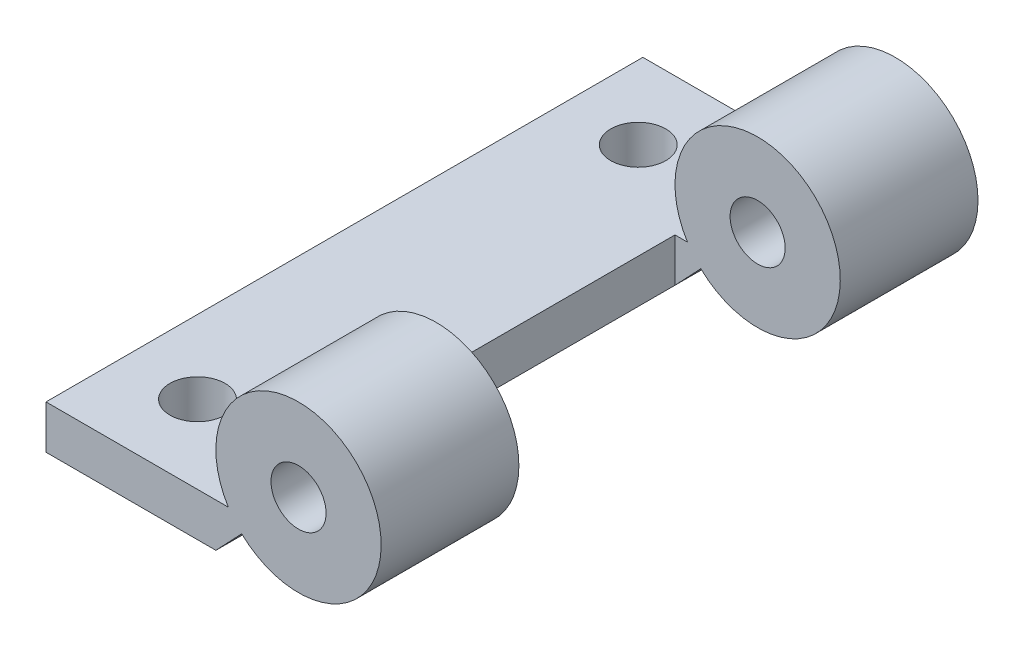
ISO-10303-21;
HEADER;
FILE_DESCRIPTION(('STEP AP214'),'2;1');
FILE_NAME('part.step','',(''),(''),'','','');
FILE_SCHEMA(('AUTOMOTIVE_DESIGN { 1 0 10303 214 1 1 1 1 }'));
ENDSEC;
DATA;
#1=APPLICATION_CONTEXT('core data for automotive mechanical design processes');
#2=APPLICATION_PROTOCOL_DEFINITION('international standard','automotive_design',2000,#1);
#3=PRODUCT_CONTEXT('',#1,'mechanical');
#4=PRODUCT('Part','Part','',(#3));
#5=PRODUCT_RELATED_PRODUCT_CATEGORY('part','',(#4));
#6=PRODUCT_DEFINITION_FORMATION('','',#4);
#7=PRODUCT_DEFINITION_CONTEXT('part definition',#1,'design');
#8=PRODUCT_DEFINITION('design','',#6,#7);
#9=PRODUCT_DEFINITION_SHAPE('','',#8);
#10=(LENGTH_UNIT() NAMED_UNIT(*) SI_UNIT(.MILLI.,.METRE.));
#11=(NAMED_UNIT(*) PLANE_ANGLE_UNIT() SI_UNIT($,.RADIAN.));
#12=(NAMED_UNIT(*) SI_UNIT($,.STERADIAN.) SOLID_ANGLE_UNIT());
#13=UNCERTAINTY_MEASURE_WITH_UNIT(LENGTH_MEASURE(1.E-05),#10,'distance_accuracy_value','');
#14=(GEOMETRIC_REPRESENTATION_CONTEXT(3) GLOBAL_UNCERTAINTY_ASSIGNED_CONTEXT((#13)) GLOBAL_UNIT_ASSIGNED_CONTEXT((#10,
#11,#12)) REPRESENTATION_CONTEXT('',''));
#15=CARTESIAN_POINT('',(0.,0.,0.));
#16=DIRECTION('',(0.,0.,1.));
#17=DIRECTION('',(1.,0.,0.));
#18=AXIS2_PLACEMENT_3D('',#15,#16,#17);
#19=CARTESIAN_POINT('',(0.,9.5,65.));
#20=DIRECTION('',(0.,0.,-1.));
#21=DIRECTION('',(-1.,0.,0.));
#22=AXIS2_PLACEMENT_3D('',#19,#20,#21);
#23=CYLINDRICAL_SURFACE('',#22,9.);
#24=DIRECTION('',(0.,0.,-1.));
#25=VECTOR('',#24,1.);
#26=CARTESIAN_POINT('',(-6.18970183119705,2.96642584484756,65.));
#27=LINE('',#26,#25);
#28=CARTESIAN_POINT('',(-6.18970183119705,2.96642584484756,65.));
#29=VERTEX_POINT('',#28);
#30=CARTESIAN_POINT('',(-6.18970183119705,2.96642584484756,50.));
#31=VERTEX_POINT('',#30);
#32=EDGE_CURVE('E152',#29,#31,#27,.T.);
#33=ORIENTED_EDGE('',*,*,#32,.T.);
#34=CARTESIAN_POINT('',(0.,9.5,50.));
#35=DIRECTION('',(0.,0.,1.));
#36=DIRECTION('',(1.,0.,0.));
#37=AXIS2_PLACEMENT_3D('',#34,#35,#36);
#38=CIRCLE('',#37,9.);
#39=CARTESIAN_POINT('',(-7.64444242571033,4.75,50.));
#40=VERTEX_POINT('',#39);
#41=EDGE_CURVE('E188',#31,#40,#38,.T.);
#42=ORIENTED_EDGE('',*,*,#41,.T.);
#43=DIRECTION('',(0.,0.,-1.));
#44=VECTOR('',#43,1.);
#45=CARTESIAN_POINT('',(-7.64444242571033,4.75,65.));
#46=LINE('',#45,#44);
#47=CARTESIAN_POINT('',(-7.64444242571033,4.75,65.));
#48=VERTEX_POINT('',#47);
#49=EDGE_CURVE('E163',#48,#40,#46,.T.);
#50=ORIENTED_EDGE('',*,*,#49,.F.);
#51=CARTESIAN_POINT('',(0.,9.5,65.));
#52=DIRECTION('',(0.,0.,1.));
#53=DIRECTION('',(1.,0.,0.));
#54=AXIS2_PLACEMENT_3D('',#51,#52,#53);
#55=CIRCLE('',#54,9.);
#56=EDGE_CURVE('E151',#29,#48,#55,.T.);
#57=ORIENTED_EDGE('',*,*,#56,.F.);
#58=EDGE_LOOP('',(#33,#42,#50,#57));
#59=FACE_BOUND('',#58,.T.);
#60=ADVANCED_FACE('F38',(#59),#23,.T.);
#61=CARTESIAN_POINT('',(-9.,0.,65.));
#62=DIRECTION('',(-0.725952683905826,0.687744647910783,0.));
#63=DIRECTION('',(-0.687744647910783,-0.725952683905827,0.));
#64=AXIS2_PLACEMENT_3D('',#61,#62,#63);
#65=PLANE('',#64);
#66=CARTESIAN_POINT('',(-6.18970183119705,2.96642584484756,15.));
#67=VERTEX_POINT('',#66);
#68=CARTESIAN_POINT('',(-6.18970183119705,2.96642584484756,0.));
#69=VERTEX_POINT('',#68);
#70=EDGE_CURVE('E89',#67,#69,#27,.T.);
#71=ORIENTED_EDGE('',*,*,#70,.F.);
#72=DIRECTION('',(-0.687744647910783,-0.725952683905827,0.));
#73=VECTOR('',#72,1.);
#74=CARTESIAN_POINT('',(-9.,0.,15.));
#75=LINE('',#74,#73);
#76=CARTESIAN_POINT('',(-9.,0.,15.));
#77=VERTEX_POINT('',#76);
#78=EDGE_CURVE('E11',#67,#77,#75,.T.);
#79=ORIENTED_EDGE('',*,*,#78,.T.);
#80=DIRECTION('',(0.,0.,-1.));
#81=VECTOR('',#80,1.);
#82=CARTESIAN_POINT('',(-9.,0.,65.));
#83=LINE('',#82,#81);
#84=CARTESIAN_POINT('',(-9.,0.,0.));
#85=VERTEX_POINT('',#84);
#86=EDGE_CURVE('E156',#77,#85,#83,.T.);
#87=ORIENTED_EDGE('',*,*,#86,.T.);
#88=DIRECTION('',(0.687744647910783,0.725952683905827,0.));
#89=VECTOR('',#88,1.);
#90=CARTESIAN_POINT('',(-9.,0.,0.));
#91=LINE('',#90,#89);
#92=EDGE_CURVE('E148',#85,#69,#91,.T.);
#93=ORIENTED_EDGE('',*,*,#92,.T.);
#94=EDGE_LOOP('',(#71,#79,#87,#93));
#95=FACE_BOUND('',#94,.T.);
#96=ADVANCED_FACE('F256',(#95),#65,.F.);
#97=CARTESIAN_POINT('',(-7.64444242571033,4.75,65.));
#98=DIRECTION('',(0.,-1.,0.));
#99=DIRECTION('',(1.,0.,0.));
#100=AXIS2_PLACEMENT_3D('',#97,#98,#99);
#101=PLANE('',#100);
#102=DIRECTION('',(0.,0.,-1.));
#103=VECTOR('',#102,1.);
#104=CARTESIAN_POINT('',(-9.,4.75,65.));
#105=LINE('',#104,#103);
#106=CARTESIAN_POINT('',(-9.,4.75,50.));
#107=VERTEX_POINT('',#106);
#108=CARTESIAN_POINT('',(-9.,4.75,15.));
#109=VERTEX_POINT('',#108);
#110=EDGE_CURVE('E213',#107,#109,#105,.T.);
#111=ORIENTED_EDGE('',*,*,#110,.T.);
#112=DIRECTION('',(1.,0.,0.));
#113=VECTOR('',#112,1.);
#114=CARTESIAN_POINT('',(-7.64444242571032,4.75,15.));
#115=LINE('',#114,#113);
#116=CARTESIAN_POINT('',(-7.64444242571033,4.75,15.));
#117=VERTEX_POINT('',#116);
#118=EDGE_CURVE('E197',#109,#117,#115,.T.);
#119=ORIENTED_EDGE('',*,*,#118,.T.);
#120=CARTESIAN_POINT('',(-7.64444242571033,4.75,0.));
#121=VERTEX_POINT('',#120);
#122=EDGE_CURVE('E162',#117,#121,#46,.T.);
#123=ORIENTED_EDGE('',*,*,#122,.T.);
#124=DIRECTION('',(-1.,0.,0.));
#125=VECTOR('',#124,1.);
#126=CARTESIAN_POINT('',(-7.64444242571033,4.75,0.));
#127=LINE('',#126,#125);
#128=CARTESIAN_POINT('',(-27.5,4.75,0.));
#129=VERTEX_POINT('',#128);
#130=EDGE_CURVE('E139',#121,#129,#127,.T.);
#131=ORIENTED_EDGE('',*,*,#130,.T.);
#132=DIRECTION('',(0.,0.,-1.));
#133=VECTOR('',#132,1.);
#134=CARTESIAN_POINT('',(-27.5,4.75,65.));
#135=LINE('',#134,#133);
#136=CARTESIAN_POINT('',(-27.5,4.75,65.));
#137=VERTEX_POINT('',#136);
#138=EDGE_CURVE('E123',#137,#129,#135,.T.);
#139=ORIENTED_EDGE('',*,*,#138,.F.);
#140=DIRECTION('',(-1.,0.,0.));
#141=VECTOR('',#140,1.);
#142=CARTESIAN_POINT('',(-7.64444242571033,4.75,65.));
#143=LINE('',#142,#141);
#144=EDGE_CURVE('E98',#48,#137,#143,.T.);
#145=ORIENTED_EDGE('',*,*,#144,.F.);
#146=ORIENTED_EDGE('',*,*,#49,.T.);
#147=DIRECTION('',(-1.,0.,0.));
#148=VECTOR('',#147,1.);
#149=CARTESIAN_POINT('',(-7.64444242571033,4.75,50.));
#150=LINE('',#149,#148);
#151=EDGE_CURVE('E207',#40,#107,#150,.T.);
#152=ORIENTED_EDGE('',*,*,#151,.T.);
#153=EDGE_LOOP('',(#111,#119,#123,#131,#139,#145,#146,#152));
#154=FACE_BOUND('',#153,.T.);
#155=CARTESIAN_POINT('',(-19.5,4.75,56.5));
#156=DIRECTION('',(0.,-1.,0.));
#157=DIRECTION('',(1.,0.,0.));
#158=AXIS2_PLACEMENT_3D('',#155,#156,#157);
#159=CIRCLE('',#158,3.);
#160=CARTESIAN_POINT('',(-16.5,4.75,56.5));
#161=VERTEX_POINT('',#160);
#162=EDGE_CURVE('E193',#161,#161,#159,.T.);
#163=ORIENTED_EDGE('',*,*,#162,.T.);
#164=EDGE_LOOP('',(#163));
#165=FACE_BOUND('',#164,.T.);
#166=CARTESIAN_POINT('',(-19.5,4.75,8.5));
#167=DIRECTION('',(0.,1.,0.));
#168=DIRECTION('',(-1.,0.,0.));
#169=AXIS2_PLACEMENT_3D('',#166,#167,#168);
#170=CIRCLE('',#169,3.);
#171=CARTESIAN_POINT('',(-22.5,4.75,8.5));
#172=VERTEX_POINT('',#171);
#173=EDGE_CURVE('E170',#172,#172,#170,.T.);
#174=ORIENTED_EDGE('',*,*,#173,.F.);
#175=EDGE_LOOP('',(#174));
#176=FACE_BOUND('',#175,.T.);
#177=ADVANCED_FACE('F261',(#154,#165,#176),#101,.F.);
#178=CARTESIAN_POINT('',(-27.5,0.,65.));
#179=DIRECTION('',(0.,1.,0.));
#180=DIRECTION('',(0.,0.,1.));
#181=AXIS2_PLACEMENT_3D('',#178,#179,#180);
#182=PLANE('',#181);
#183=DIRECTION('',(1.,0.,0.));
#184=VECTOR('',#183,1.);
#185=CARTESIAN_POINT('',(-27.5,0.,0.));
#186=LINE('',#185,#184);
#187=CARTESIAN_POINT('',(-27.5,0.,0.));
#188=VERTEX_POINT('',#187);
#189=EDGE_CURVE('E145',#188,#85,#186,.T.);
#190=ORIENTED_EDGE('',*,*,#189,.T.);
#191=ORIENTED_EDGE('',*,*,#86,.F.);
#192=CARTESIAN_POINT('',(-9.,0.,50.));
#193=VERTEX_POINT('',#192);
#194=EDGE_CURVE('E158',#193,#77,#83,.T.);
#195=ORIENTED_EDGE('',*,*,#194,.F.);
#196=CARTESIAN_POINT('',(-9.,0.,65.));
#197=VERTEX_POINT('',#196);
#198=EDGE_CURVE('E124',#197,#193,#83,.T.);
#199=ORIENTED_EDGE('',*,*,#198,.F.);
#200=DIRECTION('',(1.,0.,0.));
#201=VECTOR('',#200,1.);
#202=CARTESIAN_POINT('',(-27.5,0.,65.));
#203=LINE('',#202,#201);
#204=CARTESIAN_POINT('',(-27.5,0.,65.));
#205=VERTEX_POINT('',#204);
#206=EDGE_CURVE('E108',#205,#197,#203,.T.);
#207=ORIENTED_EDGE('',*,*,#206,.F.);
#208=DIRECTION('',(0.,0.,-1.));
#209=VECTOR('',#208,1.);
#210=CARTESIAN_POINT('',(-27.5,0.,65.));
#211=LINE('',#210,#209);
#212=EDGE_CURVE('E115',#205,#188,#211,.T.);
#213=ORIENTED_EDGE('',*,*,#212,.T.);
#214=EDGE_LOOP('',(#190,#191,#195,#199,#207,#213));
#215=FACE_BOUND('',#214,.T.);
#216=CARTESIAN_POINT('',(-19.5,0.,56.5));
#217=DIRECTION('',(0.,1.,0.));
#218=DIRECTION('',(0.,0.,1.));
#219=AXIS2_PLACEMENT_3D('',#216,#217,#218);
#220=CIRCLE('',#219,3.);
#221=CARTESIAN_POINT('',(-19.5,0.,59.5));
#222=VERTEX_POINT('',#221);
#223=EDGE_CURVE('E166',#222,#222,#220,.F.);
#224=ORIENTED_EDGE('',*,*,#223,.F.);
#225=EDGE_LOOP('',(#224));
#226=FACE_BOUND('',#225,.T.);
#227=CARTESIAN_POINT('',(-19.5,0.,8.5));
#228=DIRECTION('',(0.,1.,0.));
#229=DIRECTION('',(0.,0.,1.));
#230=AXIS2_PLACEMENT_3D('',#227,#228,#229);
#231=CIRCLE('',#230,3.);
#232=CARTESIAN_POINT('',(-19.5,0.,11.5));
#233=VERTEX_POINT('',#232);
#234=EDGE_CURVE('E140',#233,#233,#231,.T.);
#235=ORIENTED_EDGE('',*,*,#234,.T.);
#236=EDGE_LOOP('',(#235));
#237=FACE_BOUND('',#236,.T.);
#238=ADVANCED_FACE('F126',(#215,#226,#237),#182,.F.);
#239=CARTESIAN_POINT('',(0.,9.5,15.));
#240=DIRECTION('',(0.,0.,-1.));
#241=DIRECTION('',(-1.,0.,0.));
#242=AXIS2_PLACEMENT_3D('',#239,#240,#241);
#243=CIRCLE('',#242,9.);
#244=EDGE_CURVE('E204',#117,#67,#243,.T.);
#245=ORIENTED_EDGE('',*,*,#244,.T.);
#246=ORIENTED_EDGE('',*,*,#70,.T.);
#247=CARTESIAN_POINT('',(0.,9.5,0.));
#248=DIRECTION('',(0.,0.,1.));
#249=DIRECTION('',(1.,0.,0.));
#250=AXIS2_PLACEMENT_3D('',#247,#248,#249);
#251=CIRCLE('',#250,9.);
#252=EDGE_CURVE('E136',#69,#121,#251,.T.);
#253=ORIENTED_EDGE('',*,*,#252,.T.);
#254=ORIENTED_EDGE('',*,*,#122,.F.);
#255=EDGE_LOOP('',(#245,#246,#253,#254));
#256=FACE_BOUND('',#255,.T.);
#257=ADVANCED_FACE('F40',(#256),#23,.T.);
#258=CARTESIAN_POINT('',(-27.5,4.75,65.));
#259=DIRECTION('',(1.,0.,0.));
#260=DIRECTION('',(0.,0.,-1.));
#261=AXIS2_PLACEMENT_3D('',#258,#259,#260);
#262=PLANE('',#261);
#263=DIRECTION('',(0.,-1.,0.));
#264=VECTOR('',#263,1.);
#265=CARTESIAN_POINT('',(-27.5,4.75,0.));
#266=LINE('',#265,#264);
#267=EDGE_CURVE('E118',#129,#188,#266,.T.);
#268=ORIENTED_EDGE('',*,*,#267,.T.);
#269=ORIENTED_EDGE('',*,*,#212,.F.);
#270=DIRECTION('',(0.,-1.,0.));
#271=VECTOR('',#270,1.);
#272=CARTESIAN_POINT('',(-27.5,4.75,65.));
#273=LINE('',#272,#271);
#274=EDGE_CURVE('E104',#137,#205,#273,.T.);
#275=ORIENTED_EDGE('',*,*,#274,.F.);
#276=ORIENTED_EDGE('',*,*,#138,.T.);
#277=EDGE_LOOP('',(#268,#269,#275,#276));
#278=FACE_BOUND('',#277,.T.);
#279=ADVANCED_FACE('F116',(#278),#262,.F.);
#280=ORIENTED_EDGE('',*,*,#198,.T.);
#281=DIRECTION('',(0.687744647910783,0.725952683905827,0.));
#282=VECTOR('',#281,1.);
#283=CARTESIAN_POINT('',(-9.,0.,50.));
#284=LINE('',#283,#282);
#285=EDGE_CURVE('E48',#193,#31,#284,.T.);
#286=ORIENTED_EDGE('',*,*,#285,.T.);
#287=ORIENTED_EDGE('',*,*,#32,.F.);
#288=DIRECTION('',(0.687744647910783,0.725952683905827,0.));
#289=VECTOR('',#288,1.);
#290=CARTESIAN_POINT('',(-9.,0.,65.));
#291=LINE('',#290,#289);
#292=EDGE_CURVE('E64',#197,#29,#291,.T.);
#293=ORIENTED_EDGE('',*,*,#292,.F.);
#294=EDGE_LOOP('',(#280,#286,#287,#293));
#295=FACE_BOUND('',#294,.T.);
#296=ADVANCED_FACE('F178',(#295),#65,.F.);
#297=CARTESIAN_POINT('',(0.,9.5,65.));
#298=DIRECTION('',(0.,0.,1.));
#299=DIRECTION('',(1.,0.,0.));
#300=AXIS2_PLACEMENT_3D('',#297,#298,#299);
#301=PLANE('',#300);
#302=CARTESIAN_POINT('',(0.,9.5,65.));
#303=DIRECTION('',(0.,0.,1.));
#304=DIRECTION('',(1.,0.,0.));
#305=AXIS2_PLACEMENT_3D('',#302,#303,#304);
#306=CIRCLE('',#305,3.);
#307=CARTESIAN_POINT('',(3.,9.5,65.));
#308=VERTEX_POINT('',#307);
#309=EDGE_CURVE('E227',#308,#308,#306,.T.);
#310=ORIENTED_EDGE('',*,*,#309,.F.);
#311=EDGE_LOOP('',(#310));
#312=FACE_BOUND('',#311,.T.);
#313=ORIENTED_EDGE('',*,*,#56,.T.);
#314=ORIENTED_EDGE('',*,*,#144,.T.);
#315=ORIENTED_EDGE('',*,*,#274,.T.);
#316=ORIENTED_EDGE('',*,*,#206,.T.);
#317=ORIENTED_EDGE('',*,*,#292,.T.);
#318=EDGE_LOOP('',(#313,#314,#315,#316,#317));
#319=FACE_BOUND('',#318,.T.);
#320=ADVANCED_FACE('F106',(#312,#319),#301,.T.);
#321=CARTESIAN_POINT('',(0.,9.5,0.));
#322=DIRECTION('',(0.,0.,1.));
#323=DIRECTION('',(1.,0.,0.));
#324=AXIS2_PLACEMENT_3D('',#321,#322,#323);
#325=PLANE('',#324);
#326=CARTESIAN_POINT('',(0.,9.5,0.));
#327=DIRECTION('',(0.,0.,1.));
#328=DIRECTION('',(1.,0.,0.));
#329=AXIS2_PLACEMENT_3D('',#326,#327,#328);
#330=CIRCLE('',#329,3.);
#331=CARTESIAN_POINT('',(3.,9.5,0.));
#332=VERTEX_POINT('',#331);
#333=EDGE_CURVE('E231',#332,#332,#330,.T.);
#334=ORIENTED_EDGE('',*,*,#333,.T.);
#335=EDGE_LOOP('',(#334));
#336=FACE_BOUND('',#335,.T.);
#337=ORIENTED_EDGE('',*,*,#252,.F.);
#338=ORIENTED_EDGE('',*,*,#92,.F.);
#339=ORIENTED_EDGE('',*,*,#189,.F.);
#340=ORIENTED_EDGE('',*,*,#267,.F.);
#341=ORIENTED_EDGE('',*,*,#130,.F.);
#342=EDGE_LOOP('',(#337,#338,#339,#340,#341));
#343=FACE_BOUND('',#342,.T.);
#344=ADVANCED_FACE('F291',(#336,#343),#325,.F.);
#345=CARTESIAN_POINT('',(-19.5,-60.25,56.5));
#346=DIRECTION('',(0.,1.,0.));
#347=DIRECTION('',(-1.,0.,0.));
#348=AXIS2_PLACEMENT_3D('',#345,#346,#347);
#349=CYLINDRICAL_SURFACE('',#348,3.);
#350=ORIENTED_EDGE('',*,*,#162,.F.);
#351=EDGE_LOOP('',(#350));
#352=FACE_BOUND('',#351,.T.);
#353=ORIENTED_EDGE('',*,*,#223,.T.);
#354=EDGE_LOOP('',(#353));
#355=FACE_BOUND('',#354,.T.);
#356=ADVANCED_FACE('F308',(#352,#355),#349,.F.);
#357=CARTESIAN_POINT('',(-19.5,-60.25,8.5));
#358=DIRECTION('',(0.,1.,0.));
#359=DIRECTION('',(-1.,0.,0.));
#360=AXIS2_PLACEMENT_3D('',#357,#358,#359);
#361=CYLINDRICAL_SURFACE('',#360,3.);
#362=ORIENTED_EDGE('',*,*,#173,.T.);
#363=EDGE_LOOP('',(#362));
#364=FACE_BOUND('',#363,.T.);
#365=ORIENTED_EDGE('',*,*,#234,.F.);
#366=EDGE_LOOP('',(#365));
#367=FACE_BOUND('',#366,.T.);
#368=ADVANCED_FACE('F302',(#364,#367),#361,.F.);
#369=CARTESIAN_POINT('',(-8.99999999999999,-27.75,15.));
#370=DIRECTION('',(0.,0.,-1.));
#371=DIRECTION('',(-1.,0.,0.));
#372=AXIS2_PLACEMENT_3D('',#369,#370,#371);
#373=PLANE('',#372);
#374=CARTESIAN_POINT('',(0.,9.5,15.));
#375=DIRECTION('',(0.,0.,-1.));
#376=DIRECTION('',(-1.,0.,0.));
#377=AXIS2_PLACEMENT_3D('',#374,#375,#376);
#378=CIRCLE('',#377,3.);
#379=CARTESIAN_POINT('',(-3.,9.5,15.));
#380=VERTEX_POINT('',#379);
#381=EDGE_CURVE('E221',#380,#380,#378,.T.);
#382=ORIENTED_EDGE('',*,*,#381,.T.);
#383=EDGE_LOOP('',(#382));
#384=FACE_BOUND('',#383,.T.);
#385=DIRECTION('',(0.,1.,0.));
#386=VECTOR('',#385,1.);
#387=CARTESIAN_POINT('',(-8.99999999999999,-27.75,15.));
#388=LINE('',#387,#386);
#389=EDGE_CURVE('E217',#77,#109,#388,.T.);
#390=ORIENTED_EDGE('',*,*,#389,.F.);
#391=ORIENTED_EDGE('',*,*,#78,.F.);
#392=ORIENTED_EDGE('',*,*,#244,.F.);
#393=ORIENTED_EDGE('',*,*,#118,.F.);
#394=EDGE_LOOP('',(#390,#391,#392,#393));
#395=FACE_BOUND('',#394,.T.);
#396=ADVANCED_FACE('F279',(#384,#395),#373,.F.);
#397=CARTESIAN_POINT('',(-8.99999999999999,-27.75,50.));
#398=DIRECTION('',(0.,0.,1.));
#399=DIRECTION('',(1.,0.,0.));
#400=AXIS2_PLACEMENT_3D('',#397,#398,#399);
#401=PLANE('',#400);
#402=CARTESIAN_POINT('',(0.,9.5,50.));
#403=DIRECTION('',(0.,0.,1.));
#404=DIRECTION('',(1.,0.,0.));
#405=AXIS2_PLACEMENT_3D('',#402,#403,#404);
#406=CIRCLE('',#405,3.);
#407=CARTESIAN_POINT('',(3.,9.5,50.));
#408=VERTEX_POINT('',#407);
#409=EDGE_CURVE('E42',#408,#408,#406,.T.);
#410=ORIENTED_EDGE('',*,*,#409,.T.);
#411=EDGE_LOOP('',(#410));
#412=FACE_BOUND('',#411,.T.);
#413=ORIENTED_EDGE('',*,*,#41,.F.);
#414=ORIENTED_EDGE('',*,*,#285,.F.);
#415=DIRECTION('',(0.,1.,0.));
#416=VECTOR('',#415,1.);
#417=CARTESIAN_POINT('',(-8.99999999999999,-27.75,50.));
#418=LINE('',#417,#416);
#419=EDGE_CURVE('E55',#193,#107,#418,.T.);
#420=ORIENTED_EDGE('',*,*,#419,.T.);
#421=ORIENTED_EDGE('',*,*,#151,.F.);
#422=EDGE_LOOP('',(#413,#414,#420,#421));
#423=FACE_BOUND('',#422,.T.);
#424=ADVANCED_FACE('F240',(#412,#423),#401,.F.);
#425=CARTESIAN_POINT('',(-8.99999999999999,-27.75,15.));
#426=DIRECTION('',(-1.,0.,0.));
#427=DIRECTION('',(0.,-1.,0.));
#428=AXIS2_PLACEMENT_3D('',#425,#426,#427);
#429=PLANE('',#428);
#430=ORIENTED_EDGE('',*,*,#419,.F.);
#431=ORIENTED_EDGE('',*,*,#194,.T.);
#432=ORIENTED_EDGE('',*,*,#389,.T.);
#433=ORIENTED_EDGE('',*,*,#110,.F.);
#434=EDGE_LOOP('',(#430,#431,#432,#433));
#435=FACE_BOUND('',#434,.T.);
#436=ADVANCED_FACE('F245',(#435),#429,.F.);
#437=CARTESIAN_POINT('',(0.,9.5,0.));
#438=DIRECTION('',(0.,0.,1.));
#439=DIRECTION('',(1.,0.,0.));
#440=AXIS2_PLACEMENT_3D('',#437,#438,#439);
#441=CYLINDRICAL_SURFACE('',#440,3.);
#442=ORIENTED_EDGE('',*,*,#309,.T.);
#443=EDGE_LOOP('',(#442));
#444=FACE_BOUND('',#443,.T.);
#445=ORIENTED_EDGE('',*,*,#409,.F.);
#446=EDGE_LOOP('',(#445));
#447=FACE_BOUND('',#446,.T.);
#448=ADVANCED_FACE('F242',(#444,#447),#441,.F.);
#449=ORIENTED_EDGE('',*,*,#333,.F.);
#450=EDGE_LOOP('',(#449));
#451=FACE_BOUND('',#450,.T.);
#452=ORIENTED_EDGE('',*,*,#381,.F.);
#453=EDGE_LOOP('',(#452));
#454=FACE_BOUND('',#453,.T.);
#455=ADVANCED_FACE('F244',(#451,#454),#441,.F.);
#456=CLOSED_SHELL('',(#60,#96,#177,#238,#257,#279,#296,#320,#344,#356,#368,#396,#424,#436,#448,#455));
#457=MANIFOLD_SOLID_BREP('B2',#456);
#458=ADVANCED_BREP_SHAPE_REPRESENTATION('',(#18,#457),#14);
#459=SHAPE_DEFINITION_REPRESENTATION(#9,#458);
ENDSEC;
END-ISO-10303-21;
